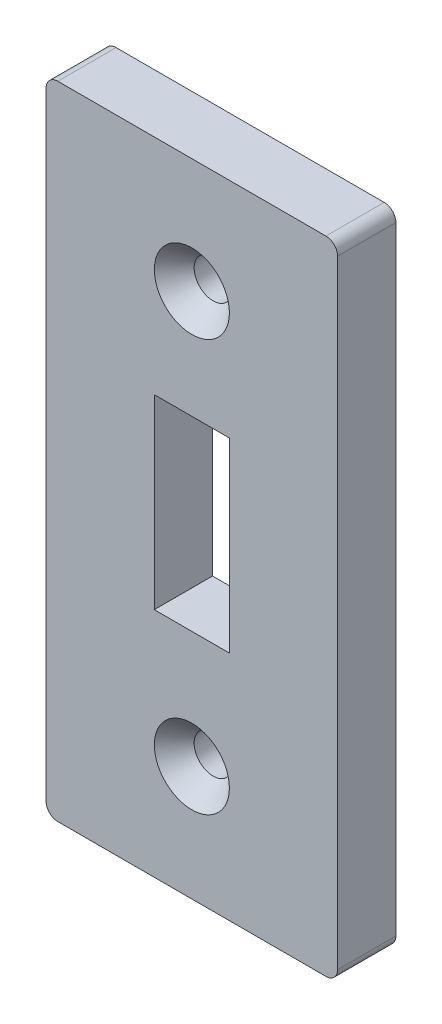
ISO-10303-21;
HEADER;
FILE_DESCRIPTION(('STEP AP214'),'2;1');
FILE_NAME('part.step','',(''),(''),'','','');
FILE_SCHEMA(('AUTOMOTIVE_DESIGN { 1 0 10303 214 1 1 1 1 }'));
ENDSEC;
DATA;
#1=APPLICATION_CONTEXT('core data for automotive mechanical design processes');
#2=APPLICATION_PROTOCOL_DEFINITION('international standard','automotive_design',2000,#1);
#3=PRODUCT_CONTEXT('',#1,'mechanical');
#4=PRODUCT('Part','Part','',(#3));
#5=PRODUCT_RELATED_PRODUCT_CATEGORY('part','',(#4));
#6=PRODUCT_DEFINITION_FORMATION('','',#4);
#7=PRODUCT_DEFINITION_CONTEXT('part definition',#1,'design');
#8=PRODUCT_DEFINITION('design','',#6,#7);
#9=PRODUCT_DEFINITION_SHAPE('','',#8);
#10=(LENGTH_UNIT() NAMED_UNIT(*) SI_UNIT(.MILLI.,.METRE.));
#11=(NAMED_UNIT(*) PLANE_ANGLE_UNIT() SI_UNIT($,.RADIAN.));
#12=(NAMED_UNIT(*) SI_UNIT($,.STERADIAN.) SOLID_ANGLE_UNIT());
#13=UNCERTAINTY_MEASURE_WITH_UNIT(LENGTH_MEASURE(1.E-05),#10,'distance_accuracy_value','');
#14=(GEOMETRIC_REPRESENTATION_CONTEXT(3) GLOBAL_UNCERTAINTY_ASSIGNED_CONTEXT((#13)) GLOBAL_UNIT_ASSIGNED_CONTEXT((#10,
#11,#12)) REPRESENTATION_CONTEXT('',''));
#15=CARTESIAN_POINT('',(0.,0.,0.));
#16=DIRECTION('',(0.,0.,1.));
#17=DIRECTION('',(1.,0.,0.));
#18=AXIS2_PLACEMENT_3D('',#15,#16,#17);
#19=CARTESIAN_POINT('',(0.,0.,10.));
#20=DIRECTION('',(0.,0.,1.));
#21=DIRECTION('',(1.,0.,0.));
#22=AXIS2_PLACEMENT_3D('',#19,#20,#21);
#23=PLANE('',#22);
#24=CARTESIAN_POINT('',(0.542522125587652,-35.5812610627938,10.));
#25=DIRECTION('',(0.,0.,1.));
#26=DIRECTION('',(1.,0.,0.));
#27=AXIS2_PLACEMENT_3D('',#24,#25,#26);
#28=CIRCLE('',#27,6.4389);
#29=CARTESIAN_POINT('',(6.98142212558765,-35.5812610627938,10.));
#30=VERTEX_POINT('',#29);
#31=EDGE_CURVE('E482',#30,#30,#28,.T.);
#32=ORIENTED_EDGE('',*,*,#31,.F.);
#33=EDGE_LOOP('',(#32));
#34=FACE_BOUND('',#33,.T.);
#35=CARTESIAN_POINT('',(0.542522125587654,35.0387389372062,10.));
#36=DIRECTION('',(0.,0.,1.));
#37=DIRECTION('',(1.,0.,0.));
#38=AXIS2_PLACEMENT_3D('',#35,#36,#37);
#39=CIRCLE('',#38,6.4389);
#40=CARTESIAN_POINT('',(6.98142212558766,35.0387389372062,10.));
#41=VERTEX_POINT('',#40);
#42=EDGE_CURVE('E467',#41,#41,#39,.T.);
#43=ORIENTED_EDGE('',*,*,#42,.F.);
#44=EDGE_LOOP('',(#43));
#45=FACE_BOUND('',#44,.T.);
#46=DIRECTION('',(0.,1.,0.));
#47=VECTOR('',#46,1.);
#48=CARTESIAN_POINT('',(25.5425221255876,54.7287389372062,10.));
#49=LINE('',#48,#47);
#50=CARTESIAN_POINT('',(25.5425221255877,-53.2712610627939,10.));
#51=VERTEX_POINT('',#50);
#52=CARTESIAN_POINT('',(25.5425221255876,52.7287389372062,10.));
#53=VERTEX_POINT('',#52);
#54=EDGE_CURVE('E194',#51,#53,#49,.T.);
#55=ORIENTED_EDGE('',*,*,#54,.T.);
#56=CARTESIAN_POINT('',(23.5425221255876,52.7287389372062,10.));
#57=DIRECTION('',(0.,0.,1.));
#58=DIRECTION('',(1.,0.,0.));
#59=AXIS2_PLACEMENT_3D('',#56,#57,#58);
#60=CIRCLE('',#59,2.);
#61=CARTESIAN_POINT('',(23.5425221255876,54.7287389372062,10.));
#62=VERTEX_POINT('',#61);
#63=EDGE_CURVE('E249',#53,#62,#60,.T.);
#64=ORIENTED_EDGE('',*,*,#63,.T.);
#65=DIRECTION('',(-1.,0.,0.));
#66=VECTOR('',#65,1.);
#67=CARTESIAN_POINT('',(-24.4574778744124,54.7287389372062,10.));
#68=LINE('',#67,#66);
#69=CARTESIAN_POINT('',(-22.4574778744124,54.7287389372062,10.));
#70=VERTEX_POINT('',#69);
#71=EDGE_CURVE('E198',#62,#70,#68,.T.);
#72=ORIENTED_EDGE('',*,*,#71,.T.);
#73=CARTESIAN_POINT('',(-22.4574778744124,52.7287389372062,10.));
#74=DIRECTION('',(0.,0.,1.));
#75=DIRECTION('',(1.,0.,0.));
#76=AXIS2_PLACEMENT_3D('',#73,#74,#75);
#77=CIRCLE('',#76,2.);
#78=CARTESIAN_POINT('',(-24.4574778744124,52.7287389372062,10.));
#79=VERTEX_POINT('',#78);
#80=EDGE_CURVE('E243',#70,#79,#77,.T.);
#81=ORIENTED_EDGE('',*,*,#80,.T.);
#82=DIRECTION('',(0.,-1.,0.));
#83=VECTOR('',#82,1.);
#84=CARTESIAN_POINT('',(-24.4574778744124,54.7287389372062,10.));
#85=LINE('',#84,#83);
#86=CARTESIAN_POINT('',(-24.4574778744124,-53.2712610627938,10.));
#87=VERTEX_POINT('',#86);
#88=EDGE_CURVE('E187',#79,#87,#85,.T.);
#89=ORIENTED_EDGE('',*,*,#88,.T.);
#90=CARTESIAN_POINT('',(-22.4574778744124,-53.2712610627938,10.));
#91=DIRECTION('',(0.,0.,1.));
#92=DIRECTION('',(1.,0.,0.));
#93=AXIS2_PLACEMENT_3D('',#90,#91,#92);
#94=CIRCLE('',#93,2.);
#95=CARTESIAN_POINT('',(-22.4574778744124,-55.2712610627938,10.));
#96=VERTEX_POINT('',#95);
#97=EDGE_CURVE('E62',#87,#96,#94,.T.);
#98=ORIENTED_EDGE('',*,*,#97,.T.);
#99=DIRECTION('',(1.,0.,0.));
#100=VECTOR('',#99,1.);
#101=CARTESIAN_POINT('',(-24.4574778744124,-55.2712610627938,10.));
#102=LINE('',#101,#100);
#103=CARTESIAN_POINT('',(23.5425221255877,-55.2712610627938,10.));
#104=VERTEX_POINT('',#103);
#105=EDGE_CURVE('E190',#96,#104,#102,.T.);
#106=ORIENTED_EDGE('',*,*,#105,.T.);
#107=CARTESIAN_POINT('',(23.5425221255877,-53.2712610627939,10.));
#108=DIRECTION('',(0.,0.,1.));
#109=DIRECTION('',(1.,0.,0.));
#110=AXIS2_PLACEMENT_3D('',#107,#108,#109);
#111=CIRCLE('',#110,2.);
#112=EDGE_CURVE('E246',#104,#51,#111,.T.);
#113=ORIENTED_EDGE('',*,*,#112,.T.);
#114=EDGE_LOOP('',(#55,#64,#72,#81,#89,#98,#106,#113));
#115=FACE_BOUND('',#114,.T.);
#116=DIRECTION('',(1.,0.,0.));
#117=VECTOR('',#116,1.);
#118=CARTESIAN_POINT('',(0.542522125587627,-15.506591960226,10.));
#119=LINE('',#118,#117);
#120=CARTESIAN_POINT('',(-5.90747787441236,-15.506591960226,10.));
#121=VERTEX_POINT('',#120);
#122=CARTESIAN_POINT('',(6.99252212558764,-15.506591960226,10.));
#123=VERTEX_POINT('',#122);
#124=EDGE_CURVE('E157',#121,#123,#119,.T.);
#125=ORIENTED_EDGE('',*,*,#124,.F.);
#126=DIRECTION('',(0.,-1.,0.));
#127=VECTOR('',#126,1.);
#128=CARTESIAN_POINT('',(-5.90747787441236,-15.506591960226,10.));
#129=LINE('',#128,#127);
#130=CARTESIAN_POINT('',(-5.90747787441236,16.443408039774,10.));
#131=VERTEX_POINT('',#130);
#132=EDGE_CURVE('E142',#131,#121,#129,.T.);
#133=ORIENTED_EDGE('',*,*,#132,.F.);
#134=DIRECTION('',(-1.,0.,0.));
#135=VECTOR('',#134,1.);
#136=CARTESIAN_POINT('',(-5.90747787441236,16.443408039774,10.));
#137=LINE('',#136,#135);
#138=CARTESIAN_POINT('',(6.99252212558764,16.443408039774,10.));
#139=VERTEX_POINT('',#138);
#140=EDGE_CURVE('E130',#139,#131,#137,.T.);
#141=ORIENTED_EDGE('',*,*,#140,.F.);
#142=DIRECTION('',(0.,1.,0.));
#143=VECTOR('',#142,1.);
#144=CARTESIAN_POINT('',(6.99252212558764,16.443408039774,10.));
#145=LINE('',#144,#143);
#146=EDGE_CURVE('E161',#123,#139,#145,.T.);
#147=ORIENTED_EDGE('',*,*,#146,.F.);
#148=EDGE_LOOP('',(#125,#133,#141,#147));
#149=FACE_BOUND('',#148,.T.);
#150=ADVANCED_FACE('F39',(#34,#45,#115,#149),#23,.T.);
#151=CARTESIAN_POINT('',(0.,0.,0.));
#152=DIRECTION('',(0.,0.,1.));
#153=DIRECTION('',(1.,0.,0.));
#154=AXIS2_PLACEMENT_3D('',#151,#152,#153);
#155=PLANE('',#154);
#156=CARTESIAN_POINT('',(0.542522125587652,-35.5812610627938,0.));
#157=DIRECTION('',(0.,0.,1.));
#158=DIRECTION('',(1.,0.,0.));
#159=AXIS2_PLACEMENT_3D('',#156,#157,#158);
#160=CIRCLE('',#159,3.2639);
#161=CARTESIAN_POINT('',(3.80642212558765,-35.5812610627938,0.));
#162=VERTEX_POINT('',#161);
#163=EDGE_CURVE('E472',#162,#162,#160,.T.);
#164=ORIENTED_EDGE('',*,*,#163,.T.);
#165=EDGE_LOOP('',(#164));
#166=FACE_BOUND('',#165,.T.);
#167=CARTESIAN_POINT('',(0.542522125587654,35.0387389372062,0.));
#168=DIRECTION('',(0.,0.,1.));
#169=DIRECTION('',(1.,0.,0.));
#170=AXIS2_PLACEMENT_3D('',#167,#168,#169);
#171=CIRCLE('',#170,3.2639);
#172=CARTESIAN_POINT('',(3.80642212558765,35.0387389372062,0.));
#173=VERTEX_POINT('',#172);
#174=EDGE_CURVE('E170',#173,#173,#171,.T.);
#175=ORIENTED_EDGE('',*,*,#174,.T.);
#176=EDGE_LOOP('',(#175));
#177=FACE_BOUND('',#176,.T.);
#178=DIRECTION('',(-1.,0.,0.));
#179=VECTOR('',#178,1.);
#180=CARTESIAN_POINT('',(-24.4574778744124,54.7287389372062,0.));
#181=LINE('',#180,#179);
#182=CARTESIAN_POINT('',(23.5425221255876,54.7287389372062,0.));
#183=VERTEX_POINT('',#182);
#184=CARTESIAN_POINT('',(-22.4574778744124,54.7287389372062,0.));
#185=VERTEX_POINT('',#184);
#186=EDGE_CURVE('E191',#183,#185,#181,.T.);
#187=ORIENTED_EDGE('',*,*,#186,.F.);
#188=CARTESIAN_POINT('',(23.5425221255876,52.7287389372062,0.));
#189=DIRECTION('',(0.,0.,1.));
#190=DIRECTION('',(1.,0.,0.));
#191=AXIS2_PLACEMENT_3D('',#188,#189,#190);
#192=CIRCLE('',#191,2.);
#193=CARTESIAN_POINT('',(25.5425221255876,52.7287389372062,0.));
#194=VERTEX_POINT('',#193);
#195=EDGE_CURVE('E231',#183,#194,#192,.F.);
#196=ORIENTED_EDGE('',*,*,#195,.T.);
#197=DIRECTION('',(0.,1.,0.));
#198=VECTOR('',#197,1.);
#199=CARTESIAN_POINT('',(25.5425221255876,54.7287389372062,0.));
#200=LINE('',#199,#198);
#201=CARTESIAN_POINT('',(25.5425221255877,-53.2712610627939,0.));
#202=VERTEX_POINT('',#201);
#203=EDGE_CURVE('E209',#202,#194,#200,.T.);
#204=ORIENTED_EDGE('',*,*,#203,.F.);
#205=CARTESIAN_POINT('',(23.5425221255877,-53.2712610627939,0.));
#206=DIRECTION('',(0.,0.,1.));
#207=DIRECTION('',(1.,0.,0.));
#208=AXIS2_PLACEMENT_3D('',#205,#206,#207);
#209=CIRCLE('',#208,2.);
#210=CARTESIAN_POINT('',(23.5425221255877,-55.2712610627938,0.));
#211=VERTEX_POINT('',#210);
#212=EDGE_CURVE('E228',#202,#211,#209,.F.);
#213=ORIENTED_EDGE('',*,*,#212,.T.);
#214=DIRECTION('',(1.,0.,0.));
#215=VECTOR('',#214,1.);
#216=CARTESIAN_POINT('',(-24.4574778744124,-55.2712610627938,0.));
#217=LINE('',#216,#215);
#218=CARTESIAN_POINT('',(-22.4574778744124,-55.2712610627938,0.));
#219=VERTEX_POINT('',#218);
#220=EDGE_CURVE('E206',#219,#211,#217,.T.);
#221=ORIENTED_EDGE('',*,*,#220,.F.);
#222=CARTESIAN_POINT('',(-22.4574778744124,-53.2712610627938,0.));
#223=DIRECTION('',(0.,0.,1.));
#224=DIRECTION('',(1.,0.,0.));
#225=AXIS2_PLACEMENT_3D('',#222,#223,#224);
#226=CIRCLE('',#225,2.);
#227=CARTESIAN_POINT('',(-24.4574778744124,-53.2712610627938,0.));
#228=VERTEX_POINT('',#227);
#229=EDGE_CURVE('E222',#219,#228,#226,.F.);
#230=ORIENTED_EDGE('',*,*,#229,.T.);
#231=DIRECTION('',(0.,-1.,0.));
#232=VECTOR('',#231,1.);
#233=CARTESIAN_POINT('',(-24.4574778744124,54.7287389372062,0.));
#234=LINE('',#233,#232);
#235=CARTESIAN_POINT('',(-24.4574778744124,52.7287389372062,0.));
#236=VERTEX_POINT('',#235);
#237=EDGE_CURVE('E153',#236,#228,#234,.T.);
#238=ORIENTED_EDGE('',*,*,#237,.F.);
#239=CARTESIAN_POINT('',(-22.4574778744124,52.7287389372062,0.));
#240=DIRECTION('',(0.,0.,1.));
#241=DIRECTION('',(1.,0.,0.));
#242=AXIS2_PLACEMENT_3D('',#239,#240,#241);
#243=CIRCLE('',#242,2.);
#244=EDGE_CURVE('E225',#236,#185,#243,.F.);
#245=ORIENTED_EDGE('',*,*,#244,.T.);
#246=EDGE_LOOP('',(#187,#196,#204,#213,#221,#230,#238,#245));
#247=FACE_BOUND('',#246,.T.);
#248=DIRECTION('',(0.,-1.,0.));
#249=VECTOR('',#248,1.);
#250=CARTESIAN_POINT('',(-5.90747787441236,-15.506591960226,0.));
#251=LINE('',#250,#249);
#252=CARTESIAN_POINT('',(-5.90747787441236,16.443408039774,0.));
#253=VERTEX_POINT('',#252);
#254=CARTESIAN_POINT('',(-5.90747787441236,-15.506591960226,0.));
#255=VERTEX_POINT('',#254);
#256=EDGE_CURVE('E150',#253,#255,#251,.T.);
#257=ORIENTED_EDGE('',*,*,#256,.T.);
#258=DIRECTION('',(1.,0.,0.));
#259=VECTOR('',#258,1.);
#260=CARTESIAN_POINT('',(6.99252212558764,-15.506591960226,0.));
#261=LINE('',#260,#259);
#262=CARTESIAN_POINT('',(6.99252212558764,-15.506591960226,0.));
#263=VERTEX_POINT('',#262);
#264=EDGE_CURVE('E169',#255,#263,#261,.T.);
#265=ORIENTED_EDGE('',*,*,#264,.T.);
#266=DIRECTION('',(0.,1.,0.));
#267=VECTOR('',#266,1.);
#268=CARTESIAN_POINT('',(6.99252212558764,16.443408039774,0.));
#269=LINE('',#268,#267);
#270=CARTESIAN_POINT('',(6.99252212558764,16.443408039774,0.));
#271=VERTEX_POINT('',#270);
#272=EDGE_CURVE('E174',#263,#271,#269,.T.);
#273=ORIENTED_EDGE('',*,*,#272,.T.);
#274=DIRECTION('',(-1.,0.,0.));
#275=VECTOR('',#274,1.);
#276=CARTESIAN_POINT('',(0.542522125587627,16.443408039774,0.));
#277=LINE('',#276,#275);
#278=EDGE_CURVE('E143',#271,#253,#277,.T.);
#279=ORIENTED_EDGE('',*,*,#278,.T.);
#280=EDGE_LOOP('',(#257,#265,#273,#279));
#281=FACE_BOUND('',#280,.T.);
#282=ADVANCED_FACE('F271',(#166,#177,#247,#281),#155,.F.);
#283=CARTESIAN_POINT('',(-24.4574778744124,54.7287389372062,10.));
#284=DIRECTION('',(1.,0.,0.));
#285=DIRECTION('',(0.,1.,0.));
#286=AXIS2_PLACEMENT_3D('',#283,#284,#285);
#287=PLANE('',#286);
#288=ORIENTED_EDGE('',*,*,#88,.F.);
#289=DIRECTION('',(0.,0.,-1.));
#290=VECTOR('',#289,1.);
#291=CARTESIAN_POINT('',(-24.4574778744124,52.7287389372062,10.));
#292=LINE('',#291,#290);
#293=EDGE_CURVE('E11',#79,#236,#292,.T.);
#294=ORIENTED_EDGE('',*,*,#293,.T.);
#295=ORIENTED_EDGE('',*,*,#237,.T.);
#296=DIRECTION('',(0.,0.,-1.));
#297=VECTOR('',#296,1.);
#298=CARTESIAN_POINT('',(-24.4574778744124,-53.2712610627938,10.));
#299=LINE('',#298,#297);
#300=EDGE_CURVE('E48',#228,#87,#299,.F.);
#301=ORIENTED_EDGE('',*,*,#300,.T.);
#302=EDGE_LOOP('',(#288,#294,#295,#301));
#303=FACE_BOUND('',#302,.T.);
#304=ADVANCED_FACE('F261',(#303),#287,.F.);
#305=CARTESIAN_POINT('',(-24.4574778744124,-55.2712610627938,10.));
#306=DIRECTION('',(0.,1.,0.));
#307=DIRECTION('',(-1.,0.,0.));
#308=AXIS2_PLACEMENT_3D('',#305,#306,#307);
#309=PLANE('',#308);
#310=ORIENTED_EDGE('',*,*,#220,.T.);
#311=DIRECTION('',(0.,0.,-1.));
#312=VECTOR('',#311,1.);
#313=CARTESIAN_POINT('',(23.5425221255877,-55.2712610627938,10.));
#314=LINE('',#313,#312);
#315=EDGE_CURVE('E55',#211,#104,#314,.F.);
#316=ORIENTED_EDGE('',*,*,#315,.T.);
#317=ORIENTED_EDGE('',*,*,#105,.F.);
#318=DIRECTION('',(0.,0.,-1.));
#319=VECTOR('',#318,1.);
#320=CARTESIAN_POINT('',(-22.4574778744124,-55.2712610627938,10.));
#321=LINE('',#320,#319);
#322=EDGE_CURVE('E252',#96,#219,#321,.T.);
#323=ORIENTED_EDGE('',*,*,#322,.T.);
#324=EDGE_LOOP('',(#310,#316,#317,#323));
#325=FACE_BOUND('',#324,.T.);
#326=ADVANCED_FACE('F268',(#325),#309,.F.);
#327=CARTESIAN_POINT('',(25.5425221255876,54.7287389372062,10.));
#328=DIRECTION('',(-1.,0.,0.));
#329=DIRECTION('',(0.,-1.,0.));
#330=AXIS2_PLACEMENT_3D('',#327,#328,#329);
#331=PLANE('',#330);
#332=ORIENTED_EDGE('',*,*,#203,.T.);
#333=DIRECTION('',(0.,0.,-1.));
#334=VECTOR('',#333,1.);
#335=CARTESIAN_POINT('',(25.5425221255876,52.7287389372062,10.));
#336=LINE('',#335,#334);
#337=EDGE_CURVE('E238',#194,#53,#336,.F.);
#338=ORIENTED_EDGE('',*,*,#337,.T.);
#339=ORIENTED_EDGE('',*,*,#54,.F.);
#340=DIRECTION('',(0.,0.,-1.));
#341=VECTOR('',#340,1.);
#342=CARTESIAN_POINT('',(25.5425221255877,-53.2712610627939,10.));
#343=LINE('',#342,#341);
#344=EDGE_CURVE('E234',#51,#202,#343,.T.);
#345=ORIENTED_EDGE('',*,*,#344,.T.);
#346=EDGE_LOOP('',(#332,#338,#339,#345));
#347=FACE_BOUND('',#346,.T.);
#348=ADVANCED_FACE('F280',(#347),#331,.F.);
#349=CARTESIAN_POINT('',(-24.4574778744124,54.7287389372062,10.));
#350=DIRECTION('',(0.,-1.,0.));
#351=DIRECTION('',(1.,0.,0.));
#352=AXIS2_PLACEMENT_3D('',#349,#350,#351);
#353=PLANE('',#352);
#354=ORIENTED_EDGE('',*,*,#71,.F.);
#355=DIRECTION('',(0.,0.,-1.));
#356=VECTOR('',#355,1.);
#357=CARTESIAN_POINT('',(23.5425221255876,54.7287389372062,10.));
#358=LINE('',#357,#356);
#359=EDGE_CURVE('E218',#62,#183,#358,.T.);
#360=ORIENTED_EDGE('',*,*,#359,.T.);
#361=ORIENTED_EDGE('',*,*,#186,.T.);
#362=DIRECTION('',(0.,0.,-1.));
#363=VECTOR('',#362,1.);
#364=CARTESIAN_POINT('',(-22.4574778744124,54.7287389372062,10.));
#365=LINE('',#364,#363);
#366=EDGE_CURVE('E202',#185,#70,#365,.F.);
#367=ORIENTED_EDGE('',*,*,#366,.T.);
#368=EDGE_LOOP('',(#354,#360,#361,#367));
#369=FACE_BOUND('',#368,.T.);
#370=ADVANCED_FACE('F288',(#369),#353,.F.);
#371=CARTESIAN_POINT('',(-5.90747787441236,-15.506591960226,10.));
#372=DIRECTION('',(1.,0.,0.));
#373=DIRECTION('',(0.,0.,-1.));
#374=AXIS2_PLACEMENT_3D('',#371,#372,#373);
#375=PLANE('',#374);
#376=ORIENTED_EDGE('',*,*,#256,.F.);
#377=DIRECTION('',(0.,0.,-1.));
#378=VECTOR('',#377,1.);
#379=CARTESIAN_POINT('',(-5.90747787441236,16.443408039774,10.));
#380=LINE('',#379,#378);
#381=EDGE_CURVE('E134',#131,#253,#380,.T.);
#382=ORIENTED_EDGE('',*,*,#381,.F.);
#383=ORIENTED_EDGE('',*,*,#132,.T.);
#384=DIRECTION('',(0.,0.,-1.));
#385=VECTOR('',#384,1.);
#386=CARTESIAN_POINT('',(-5.90747787441236,-15.506591960226,10.));
#387=LINE('',#386,#385);
#388=EDGE_CURVE('E154',#121,#255,#387,.T.);
#389=ORIENTED_EDGE('',*,*,#388,.T.);
#390=EDGE_LOOP('',(#376,#382,#383,#389));
#391=FACE_BOUND('',#390,.T.);
#392=ADVANCED_FACE('F146',(#391),#375,.T.);
#393=CARTESIAN_POINT('',(6.99252212558764,-15.506591960226,10.));
#394=DIRECTION('',(0.,1.,0.));
#395=DIRECTION('',(0.,0.,1.));
#396=AXIS2_PLACEMENT_3D('',#393,#394,#395);
#397=PLANE('',#396);
#398=ORIENTED_EDGE('',*,*,#264,.F.);
#399=ORIENTED_EDGE('',*,*,#388,.F.);
#400=ORIENTED_EDGE('',*,*,#124,.T.);
#401=DIRECTION('',(0.,0.,-1.));
#402=VECTOR('',#401,1.);
#403=CARTESIAN_POINT('',(6.99252212558764,-15.506591960226,10.));
#404=LINE('',#403,#402);
#405=EDGE_CURVE('E182',#123,#263,#404,.T.);
#406=ORIENTED_EDGE('',*,*,#405,.T.);
#407=EDGE_LOOP('',(#398,#399,#400,#406));
#408=FACE_BOUND('',#407,.T.);
#409=ADVANCED_FACE('F347',(#408),#397,.T.);
#410=CARTESIAN_POINT('',(6.99252212558764,16.443408039774,10.));
#411=DIRECTION('',(-1.,0.,0.));
#412=DIRECTION('',(0.,0.,1.));
#413=AXIS2_PLACEMENT_3D('',#410,#411,#412);
#414=PLANE('',#413);
#415=ORIENTED_EDGE('',*,*,#272,.F.);
#416=ORIENTED_EDGE('',*,*,#405,.F.);
#417=ORIENTED_EDGE('',*,*,#146,.T.);
#418=DIRECTION('',(0.,0.,-1.));
#419=VECTOR('',#418,1.);
#420=CARTESIAN_POINT('',(6.99252212558764,16.443408039774,10.));
#421=LINE('',#420,#419);
#422=EDGE_CURVE('E136',#139,#271,#421,.T.);
#423=ORIENTED_EDGE('',*,*,#422,.T.);
#424=EDGE_LOOP('',(#415,#416,#417,#423));
#425=FACE_BOUND('',#424,.T.);
#426=ADVANCED_FACE('F345',(#425),#414,.T.);
#427=CARTESIAN_POINT('',(0.542522125587627,16.443408039774,10.));
#428=DIRECTION('',(0.,-1.,0.));
#429=DIRECTION('',(0.,0.,-1.));
#430=AXIS2_PLACEMENT_3D('',#427,#428,#429);
#431=PLANE('',#430);
#432=ORIENTED_EDGE('',*,*,#278,.F.);
#433=ORIENTED_EDGE('',*,*,#422,.F.);
#434=ORIENTED_EDGE('',*,*,#140,.T.);
#435=ORIENTED_EDGE('',*,*,#381,.T.);
#436=EDGE_LOOP('',(#432,#433,#434,#435));
#437=FACE_BOUND('',#436,.T.);
#438=ADVANCED_FACE('F133',(#437),#431,.T.);
#439=CARTESIAN_POINT('',(0.542522125587654,35.0387389372062,10.));
#440=DIRECTION('',(0.,0.,1.));
#441=DIRECTION('',(1.,0.,0.));
#442=AXIS2_PLACEMENT_3D('',#439,#440,#441);
#443=CYLINDRICAL_SURFACE('',#442,3.26389999999999);
#444=ORIENTED_EDGE('',*,*,#174,.F.);
#445=EDGE_LOOP('',(#444));
#446=FACE_BOUND('',#445,.T.);
#447=CARTESIAN_POINT('',(0.542522125587654,35.0387389372062,6.34758030707329));
#448=DIRECTION('',(0.,0.,1.));
#449=DIRECTION('',(1.,0.,0.));
#450=AXIS2_PLACEMENT_3D('',#447,#448,#449);
#451=CIRCLE('',#450,3.26389999999999);
#452=CARTESIAN_POINT('',(3.80642212558764,35.0387389372062,6.34758030707329));
#453=VERTEX_POINT('',#452);
#454=EDGE_CURVE('E465',#453,#453,#451,.T.);
#455=ORIENTED_EDGE('',*,*,#454,.T.);
#456=EDGE_LOOP('',(#455));
#457=FACE_BOUND('',#456,.T.);
#458=ADVANCED_FACE('F338',(#446,#457),#443,.F.);
#459=CARTESIAN_POINT('',(0.542522125587654,35.0387389372062,10.));
#460=DIRECTION('',(0.,0.,1.));
#461=DIRECTION('',(1.,0.,0.));
#462=AXIS2_PLACEMENT_3D('',#459,#460,#461);
#463=CONICAL_SURFACE('',#462,6.4389,0.715584993317677);
#464=ORIENTED_EDGE('',*,*,#454,.F.);
#465=EDGE_LOOP('',(#464));
#466=FACE_BOUND('',#465,.T.);
#467=ORIENTED_EDGE('',*,*,#42,.T.);
#468=EDGE_LOOP('',(#467));
#469=FACE_BOUND('',#468,.T.);
#470=ADVANCED_FACE('F330',(#466,#469),#463,.F.);
#471=CARTESIAN_POINT('',(0.542522125587652,-35.5812610627938,10.));
#472=DIRECTION('',(0.,0.,1.));
#473=DIRECTION('',(1.,0.,0.));
#474=AXIS2_PLACEMENT_3D('',#471,#472,#473);
#475=CYLINDRICAL_SURFACE('',#474,3.26389999999999);
#476=ORIENTED_EDGE('',*,*,#163,.F.);
#477=EDGE_LOOP('',(#476));
#478=FACE_BOUND('',#477,.T.);
#479=CARTESIAN_POINT('',(0.542522125587652,-35.5812610627938,6.34758030707329));
#480=DIRECTION('',(0.,0.,1.));
#481=DIRECTION('',(1.,0.,0.));
#482=AXIS2_PLACEMENT_3D('',#479,#480,#481);
#483=CIRCLE('',#482,3.26389999999999);
#484=CARTESIAN_POINT('',(3.80642212558764,-35.5812610627938,6.34758030707329));
#485=VERTEX_POINT('',#484);
#486=EDGE_CURVE('E478',#485,#485,#483,.T.);
#487=ORIENTED_EDGE('',*,*,#486,.T.);
#488=EDGE_LOOP('',(#487));
#489=FACE_BOUND('',#488,.T.);
#490=ADVANCED_FACE('F324',(#478,#489),#475,.F.);
#491=CARTESIAN_POINT('',(0.542522125587652,-35.5812610627938,10.));
#492=DIRECTION('',(0.,0.,1.));
#493=DIRECTION('',(1.,0.,0.));
#494=AXIS2_PLACEMENT_3D('',#491,#492,#493);
#495=CONICAL_SURFACE('',#494,6.4389,0.715584993317677);
#496=ORIENTED_EDGE('',*,*,#486,.F.);
#497=EDGE_LOOP('',(#496));
#498=FACE_BOUND('',#497,.T.);
#499=ORIENTED_EDGE('',*,*,#31,.T.);
#500=EDGE_LOOP('',(#499));
#501=FACE_BOUND('',#500,.T.);
#502=ADVANCED_FACE('F320',(#498,#501),#495,.F.);
#503=CARTESIAN_POINT('',(23.5425221255876,52.7287389372062,10.));
#504=DIRECTION('',(0.,0.,-1.));
#505=DIRECTION('',(-1.,0.,0.));
#506=AXIS2_PLACEMENT_3D('',#503,#504,#505);
#507=CYLINDRICAL_SURFACE('',#506,2.);
#508=ORIENTED_EDGE('',*,*,#63,.F.);
#509=ORIENTED_EDGE('',*,*,#337,.F.);
#510=ORIENTED_EDGE('',*,*,#195,.F.);
#511=ORIENTED_EDGE('',*,*,#359,.F.);
#512=EDGE_LOOP('',(#508,#509,#510,#511));
#513=FACE_BOUND('',#512,.T.);
#514=ADVANCED_FACE('F286',(#513),#507,.T.);
#515=CARTESIAN_POINT('',(23.5425221255877,-53.2712610627939,10.));
#516=DIRECTION('',(0.,0.,-1.));
#517=DIRECTION('',(-1.,0.,0.));
#518=AXIS2_PLACEMENT_3D('',#515,#516,#517);
#519=CYLINDRICAL_SURFACE('',#518,2.);
#520=ORIENTED_EDGE('',*,*,#112,.F.);
#521=ORIENTED_EDGE('',*,*,#315,.F.);
#522=ORIENTED_EDGE('',*,*,#212,.F.);
#523=ORIENTED_EDGE('',*,*,#344,.F.);
#524=EDGE_LOOP('',(#520,#521,#522,#523));
#525=FACE_BOUND('',#524,.T.);
#526=ADVANCED_FACE('F277',(#525),#519,.T.);
#527=CARTESIAN_POINT('',(-22.4574778744124,52.7287389372062,10.));
#528=DIRECTION('',(0.,0.,-1.));
#529=DIRECTION('',(-1.,0.,0.));
#530=AXIS2_PLACEMENT_3D('',#527,#528,#529);
#531=CYLINDRICAL_SURFACE('',#530,2.);
#532=ORIENTED_EDGE('',*,*,#80,.F.);
#533=ORIENTED_EDGE('',*,*,#366,.F.);
#534=ORIENTED_EDGE('',*,*,#244,.F.);
#535=ORIENTED_EDGE('',*,*,#293,.F.);
#536=EDGE_LOOP('',(#532,#533,#534,#535));
#537=FACE_BOUND('',#536,.T.);
#538=ADVANCED_FACE('F291',(#537),#531,.T.);
#539=CARTESIAN_POINT('',(-22.4574778744124,-53.2712610627938,10.));
#540=DIRECTION('',(0.,0.,-1.));
#541=DIRECTION('',(-1.,0.,0.));
#542=AXIS2_PLACEMENT_3D('',#539,#540,#541);
#543=CYLINDRICAL_SURFACE('',#542,2.);
#544=ORIENTED_EDGE('',*,*,#97,.F.);
#545=ORIENTED_EDGE('',*,*,#300,.F.);
#546=ORIENTED_EDGE('',*,*,#229,.F.);
#547=ORIENTED_EDGE('',*,*,#322,.F.);
#548=EDGE_LOOP('',(#544,#545,#546,#547));
#549=FACE_BOUND('',#548,.T.);
#550=ADVANCED_FACE('F41',(#549),#543,.T.);
#551=CLOSED_SHELL('',(#150,#282,#304,#326,#348,#370,#392,#409,#426,#438,#458,#470,#490,#502,
#514,#526,#538,#550));
#552=MANIFOLD_SOLID_BREP('B2',#551);
#553=ADVANCED_BREP_SHAPE_REPRESENTATION('',(#18,#552),#14);
#554=SHAPE_DEFINITION_REPRESENTATION(#9,#553);
ENDSEC;
END-ISO-10303-21;
